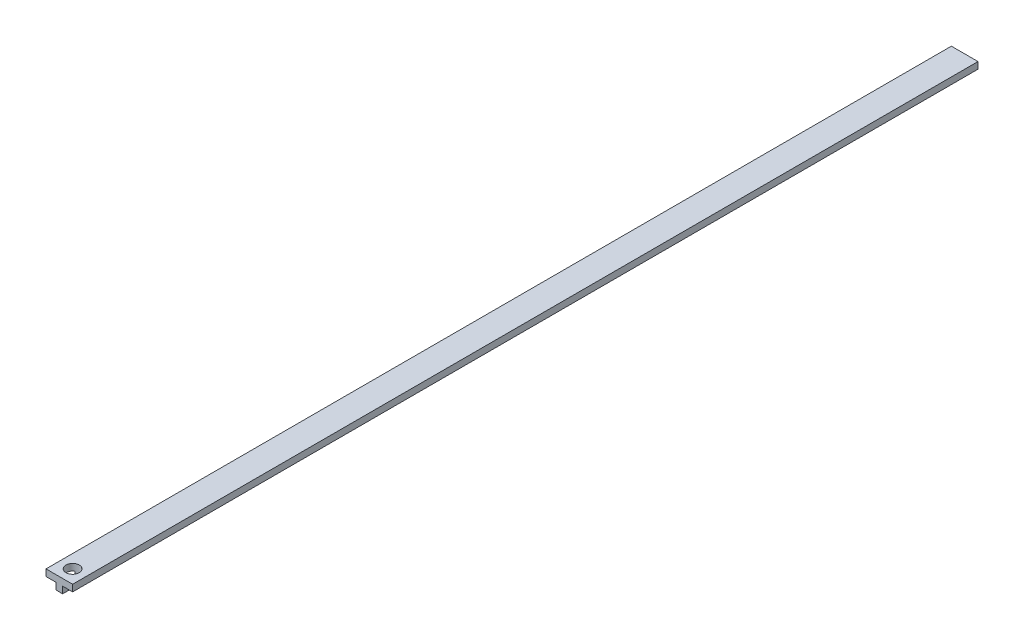
ISO-10303-21;
HEADER;
FILE_DESCRIPTION(('STEP AP214'),'2;1');
FILE_NAME('part.step','',(''),(''),'','','');
FILE_SCHEMA(('AUTOMOTIVE_DESIGN { 1 0 10303 214 1 1 1 1 }'));
ENDSEC;
DATA;
#1=APPLICATION_CONTEXT('core data for automotive mechanical design processes');
#2=APPLICATION_PROTOCOL_DEFINITION('international standard','automotive_design',2000,#1);
#3=PRODUCT_CONTEXT('',#1,'mechanical');
#4=PRODUCT('Part','Part','',(#3));
#5=PRODUCT_RELATED_PRODUCT_CATEGORY('part','',(#4));
#6=PRODUCT_DEFINITION_FORMATION('','',#4);
#7=PRODUCT_DEFINITION_CONTEXT('part definition',#1,'design');
#8=PRODUCT_DEFINITION('design','',#6,#7);
#9=PRODUCT_DEFINITION_SHAPE('','',#8);
#10=(LENGTH_UNIT() NAMED_UNIT(*) SI_UNIT(.MILLI.,.METRE.));
#11=(NAMED_UNIT(*) PLANE_ANGLE_UNIT() SI_UNIT($,.RADIAN.));
#12=(NAMED_UNIT(*) SI_UNIT($,.STERADIAN.) SOLID_ANGLE_UNIT());
#13=UNCERTAINTY_MEASURE_WITH_UNIT(LENGTH_MEASURE(1.E-05),#10,'distance_accuracy_value','');
#14=(GEOMETRIC_REPRESENTATION_CONTEXT(3) GLOBAL_UNCERTAINTY_ASSIGNED_CONTEXT((#13)) GLOBAL_UNIT_ASSIGNED_CONTEXT((#10,
#11,#12)) REPRESENTATION_CONTEXT('',''));
#15=CARTESIAN_POINT('',(0.,0.,0.));
#16=DIRECTION('',(0.,0.,1.));
#17=DIRECTION('',(1.,0.,0.));
#18=AXIS2_PLACEMENT_3D('',#15,#16,#17);
#19=CARTESIAN_POINT('',(-1.5875,-3.175,215.9));
#20=DIRECTION('',(1.,0.,0.));
#21=DIRECTION('',(0.,1.,0.));
#22=AXIS2_PLACEMENT_3D('',#19,#20,#21);
#23=PLANE('',#22);
#24=DIRECTION('',(0.,0.,-1.));
#25=VECTOR('',#24,1.);
#26=CARTESIAN_POINT('',(-1.5875,-3.175,215.9));
#27=LINE('',#26,#25);
#28=CARTESIAN_POINT('',(-1.58750000000001,-3.175,206.800369342984));
#29=VERTEX_POINT('',#28);
#30=CARTESIAN_POINT('',(-1.5875,-3.175,-215.9));
#31=VERTEX_POINT('',#30);
#32=EDGE_CURVE('E205',#29,#31,#27,.T.);
#33=ORIENTED_EDGE('',*,*,#32,.F.);
#34=DIRECTION('',(0.,1.,0.));
#35=VECTOR('',#34,1.);
#36=CARTESIAN_POINT('',(-1.5875,-3.175,206.800369342984));
#37=LINE('',#36,#35);
#38=CARTESIAN_POINT('',(-1.5875,0.,206.800369342984));
#39=VERTEX_POINT('',#38);
#40=EDGE_CURVE('E176',#29,#39,#37,.T.);
#41=ORIENTED_EDGE('',*,*,#40,.T.);
#42=DIRECTION('',(0.,0.,-1.));
#43=VECTOR('',#42,1.);
#44=CARTESIAN_POINT('',(-1.5875,0.,215.9));
#45=LINE('',#44,#43);
#46=CARTESIAN_POINT('',(-1.5875,0.,-215.9));
#47=VERTEX_POINT('',#46);
#48=EDGE_CURVE('E209',#39,#47,#45,.T.);
#49=ORIENTED_EDGE('',*,*,#48,.T.);
#50=DIRECTION('',(0.,-1.,0.));
#51=VECTOR('',#50,1.);
#52=CARTESIAN_POINT('',(-1.5875,-3.175,-215.9));
#53=LINE('',#52,#51);
#54=EDGE_CURVE('E179',#47,#31,#53,.T.);
#55=ORIENTED_EDGE('',*,*,#54,.T.);
#56=EDGE_LOOP('',(#33,#41,#49,#55));
#57=FACE_BOUND('',#56,.T.);
#58=ADVANCED_FACE('F45',(#57),#23,.F.);
#59=CARTESIAN_POINT('',(1.5875,-3.175,215.9));
#60=DIRECTION('',(0.,1.,0.));
#61=DIRECTION('',(0.,0.,1.));
#62=AXIS2_PLACEMENT_3D('',#59,#60,#61);
#63=PLANE('',#62);
#64=DIRECTION('',(0.,0.,-1.));
#65=VECTOR('',#64,1.);
#66=CARTESIAN_POINT('',(1.5875,-3.175,215.9));
#67=LINE('',#66,#65);
#68=CARTESIAN_POINT('',(1.5875,-3.175,206.800369342984));
#69=VERTEX_POINT('',#68);
#70=CARTESIAN_POINT('',(1.5875,-3.175,-215.9));
#71=VERTEX_POINT('',#70);
#72=EDGE_CURVE('E200',#69,#71,#67,.T.);
#73=ORIENTED_EDGE('',*,*,#72,.F.);
#74=CARTESIAN_POINT('',(0.,-3.175,209.55));
#75=DIRECTION('',(0.,1.,0.));
#76=DIRECTION('',(-1.,0.,0.));
#77=AXIS2_PLACEMENT_3D('',#74,#75,#76);
#78=CIRCLE('',#77,3.175);
#79=EDGE_CURVE('E240',#69,#29,#78,.T.);
#80=ORIENTED_EDGE('',*,*,#79,.T.);
#81=ORIENTED_EDGE('',*,*,#32,.T.);
#82=DIRECTION('',(1.,0.,0.));
#83=VECTOR('',#82,1.);
#84=CARTESIAN_POINT('',(1.5875,-3.175,-215.9));
#85=LINE('',#84,#83);
#86=EDGE_CURVE('E182',#31,#71,#85,.T.);
#87=ORIENTED_EDGE('',*,*,#86,.T.);
#88=EDGE_LOOP('',(#73,#80,#81,#87));
#89=FACE_BOUND('',#88,.T.);
#90=ADVANCED_FACE('F236',(#89),#63,.F.);
#91=CARTESIAN_POINT('',(1.5875,0.,215.9));
#92=DIRECTION('',(-1.,0.,0.));
#93=DIRECTION('',(0.,-1.,0.));
#94=AXIS2_PLACEMENT_3D('',#91,#92,#93);
#95=PLANE('',#94);
#96=CARTESIAN_POINT('',(1.5875,-3.175,215.9));
#97=VERTEX_POINT('',#96);
#98=CARTESIAN_POINT('',(1.5875,-3.175,212.299630657016));
#99=VERTEX_POINT('',#98);
#100=EDGE_CURVE('E201',#97,#99,#67,.T.);
#101=ORIENTED_EDGE('',*,*,#100,.T.);
#102=DIRECTION('',(0.,1.,0.));
#103=VECTOR('',#102,1.);
#104=CARTESIAN_POINT('',(1.5875,-3.175,212.299630657016));
#105=LINE('',#104,#103);
#106=CARTESIAN_POINT('',(1.5875,0.,212.299630657016));
#107=VERTEX_POINT('',#106);
#108=EDGE_CURVE('E256',#99,#107,#105,.T.);
#109=ORIENTED_EDGE('',*,*,#108,.T.);
#110=DIRECTION('',(0.,0.,-1.));
#111=VECTOR('',#110,1.);
#112=CARTESIAN_POINT('',(1.5875,0.,215.9));
#113=LINE('',#112,#111);
#114=CARTESIAN_POINT('',(1.5875,0.,215.9));
#115=VERTEX_POINT('',#114);
#116=EDGE_CURVE('E197',#115,#107,#113,.T.);
#117=ORIENTED_EDGE('',*,*,#116,.F.);
#118=DIRECTION('',(0.,1.,0.));
#119=VECTOR('',#118,1.);
#120=CARTESIAN_POINT('',(1.5875,0.,215.9));
#121=LINE('',#120,#119);
#122=EDGE_CURVE('E146',#97,#115,#121,.T.);
#123=ORIENTED_EDGE('',*,*,#122,.F.);
#124=EDGE_LOOP('',(#101,#109,#117,#123));
#125=FACE_BOUND('',#124,.T.);
#126=ADVANCED_FACE('F286',(#125),#95,.F.);
#127=CARTESIAN_POINT('',(-6.35,0.,215.9));
#128=DIRECTION('',(1.,0.,0.));
#129=DIRECTION('',(0.,1.,0.));
#130=AXIS2_PLACEMENT_3D('',#127,#128,#129);
#131=PLANE('',#130);
#132=DIRECTION('',(0.,-1.,0.));
#133=VECTOR('',#132,1.);
#134=CARTESIAN_POINT('',(-6.35,0.,-215.9));
#135=LINE('',#134,#133);
#136=CARTESIAN_POINT('',(-6.35,3.175,-215.9));
#137=VERTEX_POINT('',#136);
#138=CARTESIAN_POINT('',(-6.35,0.,-215.9));
#139=VERTEX_POINT('',#138);
#140=EDGE_CURVE('E172',#137,#139,#135,.T.);
#141=ORIENTED_EDGE('',*,*,#140,.T.);
#142=DIRECTION('',(0.,0.,-1.));
#143=VECTOR('',#142,1.);
#144=CARTESIAN_POINT('',(-6.35,0.,215.9));
#145=LINE('',#144,#143);
#146=CARTESIAN_POINT('',(-6.35,0.,215.9));
#147=VERTEX_POINT('',#146);
#148=EDGE_CURVE('E11',#147,#139,#145,.T.);
#149=ORIENTED_EDGE('',*,*,#148,.F.);
#150=DIRECTION('',(0.,-1.,0.));
#151=VECTOR('',#150,1.);
#152=CARTESIAN_POINT('',(-6.35,0.,215.9));
#153=LINE('',#152,#151);
#154=CARTESIAN_POINT('',(-6.35,3.175,215.9));
#155=VERTEX_POINT('',#154);
#156=EDGE_CURVE('E192',#155,#147,#153,.T.);
#157=ORIENTED_EDGE('',*,*,#156,.F.);
#158=DIRECTION('',(0.,0.,-1.));
#159=VECTOR('',#158,1.);
#160=CARTESIAN_POINT('',(-6.35,3.175,215.9));
#161=LINE('',#160,#159);
#162=EDGE_CURVE('E168',#155,#137,#161,.T.);
#163=ORIENTED_EDGE('',*,*,#162,.T.);
#164=EDGE_LOOP('',(#141,#149,#157,#163));
#165=FACE_BOUND('',#164,.T.);
#166=ADVANCED_FACE('F47',(#165),#131,.F.);
#167=CARTESIAN_POINT('',(-1.5875,0.,215.9));
#168=DIRECTION('',(0.,1.,0.));
#169=DIRECTION('',(-1.,0.,0.));
#170=AXIS2_PLACEMENT_3D('',#167,#168,#169);
#171=PLANE('',#170);
#172=ORIENTED_EDGE('',*,*,#48,.F.);
#173=CARTESIAN_POINT('',(0.,0.,209.55));
#174=DIRECTION('',(0.,1.,0.));
#175=DIRECTION('',(-1.,0.,0.));
#176=AXIS2_PLACEMENT_3D('',#173,#174,#175);
#177=CIRCLE('',#176,3.175);
#178=CARTESIAN_POINT('',(-1.5875,0.,212.299630657016));
#179=VERTEX_POINT('',#178);
#180=EDGE_CURVE('E248',#39,#179,#177,.T.);
#181=ORIENTED_EDGE('',*,*,#180,.T.);
#182=CARTESIAN_POINT('',(-1.5875,0.,215.9));
#183=VERTEX_POINT('',#182);
#184=EDGE_CURVE('E54',#183,#179,#45,.T.);
#185=ORIENTED_EDGE('',*,*,#184,.F.);
#186=DIRECTION('',(1.,0.,0.));
#187=VECTOR('',#186,1.);
#188=CARTESIAN_POINT('',(-1.5875,0.,215.9));
#189=LINE('',#188,#187);
#190=EDGE_CURVE('E118',#147,#183,#189,.T.);
#191=ORIENTED_EDGE('',*,*,#190,.F.);
#192=ORIENTED_EDGE('',*,*,#148,.T.);
#193=DIRECTION('',(1.,0.,0.));
#194=VECTOR('',#193,1.);
#195=CARTESIAN_POINT('',(-1.5875,0.,-215.9));
#196=LINE('',#195,#194);
#197=EDGE_CURVE('E175',#139,#47,#196,.T.);
#198=ORIENTED_EDGE('',*,*,#197,.T.);
#199=EDGE_LOOP('',(#172,#181,#185,#191,#192,#198));
#200=FACE_BOUND('',#199,.T.);
#201=ADVANCED_FACE('F228',(#200),#171,.F.);
#202=ORIENTED_EDGE('',*,*,#184,.T.);
#203=DIRECTION('',(0.,1.,0.));
#204=VECTOR('',#203,1.);
#205=CARTESIAN_POINT('',(-1.5875,-3.175,212.299630657016));
#206=LINE('',#205,#204);
#207=CARTESIAN_POINT('',(-1.58750000000001,-3.175,212.299630657016));
#208=VERTEX_POINT('',#207);
#209=EDGE_CURVE('E249',#179,#208,#206,.F.);
#210=ORIENTED_EDGE('',*,*,#209,.T.);
#211=CARTESIAN_POINT('',(-1.5875,-3.175,215.9));
#212=VERTEX_POINT('',#211);
#213=EDGE_CURVE('E206',#212,#208,#27,.T.);
#214=ORIENTED_EDGE('',*,*,#213,.F.);
#215=DIRECTION('',(0.,-1.,0.));
#216=VECTOR('',#215,1.);
#217=CARTESIAN_POINT('',(-1.5875,-3.175,215.9));
#218=LINE('',#217,#216);
#219=EDGE_CURVE('E271',#183,#212,#218,.T.);
#220=ORIENTED_EDGE('',*,*,#219,.F.);
#221=EDGE_LOOP('',(#202,#210,#214,#220));
#222=FACE_BOUND('',#221,.T.);
#223=ADVANCED_FACE('F301',(#222),#23,.F.);
#224=ORIENTED_EDGE('',*,*,#213,.T.);
#225=EDGE_CURVE('E252',#208,#99,#78,.T.);
#226=ORIENTED_EDGE('',*,*,#225,.T.);
#227=ORIENTED_EDGE('',*,*,#100,.F.);
#228=DIRECTION('',(1.,0.,0.));
#229=VECTOR('',#228,1.);
#230=CARTESIAN_POINT('',(1.5875,-3.175,215.9));
#231=LINE('',#230,#229);
#232=EDGE_CURVE('E274',#212,#97,#231,.T.);
#233=ORIENTED_EDGE('',*,*,#232,.F.);
#234=EDGE_LOOP('',(#224,#226,#227,#233));
#235=FACE_BOUND('',#234,.T.);
#236=ADVANCED_FACE('F282',(#235),#63,.F.);
#237=CARTESIAN_POINT('',(1.5875,0.,206.800369342984));
#238=VERTEX_POINT('',#237);
#239=CARTESIAN_POINT('',(1.5875,0.,-215.9));
#240=VERTEX_POINT('',#239);
#241=EDGE_CURVE('E160',#238,#240,#113,.T.);
#242=ORIENTED_EDGE('',*,*,#241,.F.);
#243=DIRECTION('',(0.,1.,0.));
#244=VECTOR('',#243,1.);
#245=CARTESIAN_POINT('',(1.5875,-3.175,206.800369342984));
#246=LINE('',#245,#244);
#247=EDGE_CURVE('E64',#238,#69,#246,.F.);
#248=ORIENTED_EDGE('',*,*,#247,.T.);
#249=ORIENTED_EDGE('',*,*,#72,.T.);
#250=DIRECTION('',(0.,1.,0.));
#251=VECTOR('',#250,1.);
#252=CARTESIAN_POINT('',(1.5875,0.,-215.9));
#253=LINE('',#252,#251);
#254=EDGE_CURVE('E185',#71,#240,#253,.T.);
#255=ORIENTED_EDGE('',*,*,#254,.T.);
#256=EDGE_LOOP('',(#242,#248,#249,#255));
#257=FACE_BOUND('',#256,.T.);
#258=ADVANCED_FACE('F308',(#257),#95,.F.);
#259=CARTESIAN_POINT('',(6.35,0.,215.9));
#260=DIRECTION('',(0.,1.,0.));
#261=DIRECTION('',(-1.,0.,0.));
#262=AXIS2_PLACEMENT_3D('',#259,#260,#261);
#263=PLANE('',#262);
#264=ORIENTED_EDGE('',*,*,#116,.T.);
#265=CARTESIAN_POINT('',(0.,0.,209.55));
#266=DIRECTION('',(0.,1.,0.));
#267=DIRECTION('',(-1.,0.,0.));
#268=AXIS2_PLACEMENT_3D('',#265,#266,#267);
#269=CIRCLE('',#268,3.175);
#270=EDGE_CURVE('E251',#107,#238,#269,.T.);
#271=ORIENTED_EDGE('',*,*,#270,.T.);
#272=ORIENTED_EDGE('',*,*,#241,.T.);
#273=DIRECTION('',(1.,0.,0.));
#274=VECTOR('',#273,1.);
#275=CARTESIAN_POINT('',(6.35,0.,-215.9));
#276=LINE('',#275,#274);
#277=CARTESIAN_POINT('',(6.35,0.,-215.9));
#278=VERTEX_POINT('',#277);
#279=EDGE_CURVE('E156',#240,#278,#276,.T.);
#280=ORIENTED_EDGE('',*,*,#279,.T.);
#281=DIRECTION('',(0.,0.,-1.));
#282=VECTOR('',#281,1.);
#283=CARTESIAN_POINT('',(6.35,0.,215.9));
#284=LINE('',#283,#282);
#285=CARTESIAN_POINT('',(6.35,0.,215.9));
#286=VERTEX_POINT('',#285);
#287=EDGE_CURVE('E153',#286,#278,#284,.T.);
#288=ORIENTED_EDGE('',*,*,#287,.F.);
#289=DIRECTION('',(1.,0.,0.));
#290=VECTOR('',#289,1.);
#291=CARTESIAN_POINT('',(6.35,0.,215.9));
#292=LINE('',#291,#290);
#293=EDGE_CURVE('E139',#115,#286,#292,.T.);
#294=ORIENTED_EDGE('',*,*,#293,.F.);
#295=EDGE_LOOP('',(#264,#271,#272,#280,#288,#294));
#296=FACE_BOUND('',#295,.T.);
#297=ADVANCED_FACE('F154',(#296),#263,.F.);
#298=CARTESIAN_POINT('',(6.35,3.175,215.9));
#299=DIRECTION('',(-1.,0.,0.));
#300=DIRECTION('',(0.,-1.,0.));
#301=AXIS2_PLACEMENT_3D('',#298,#299,#300);
#302=PLANE('',#301);
#303=DIRECTION('',(0.,1.,0.));
#304=VECTOR('',#303,1.);
#305=CARTESIAN_POINT('',(6.35,3.175,-215.9));
#306=LINE('',#305,#304);
#307=CARTESIAN_POINT('',(6.35,3.175,-215.9));
#308=VERTEX_POINT('',#307);
#309=EDGE_CURVE('E189',#278,#308,#306,.T.);
#310=ORIENTED_EDGE('',*,*,#309,.T.);
#311=DIRECTION('',(0.,0.,-1.));
#312=VECTOR('',#311,1.);
#313=CARTESIAN_POINT('',(6.35,3.175,215.9));
#314=LINE('',#313,#312);
#315=CARTESIAN_POINT('',(6.35,3.175,215.9));
#316=VERTEX_POINT('',#315);
#317=EDGE_CURVE('E161',#316,#308,#314,.T.);
#318=ORIENTED_EDGE('',*,*,#317,.F.);
#319=DIRECTION('',(0.,1.,0.));
#320=VECTOR('',#319,1.);
#321=CARTESIAN_POINT('',(6.35,3.175,215.9));
#322=LINE('',#321,#320);
#323=EDGE_CURVE('E143',#286,#316,#322,.T.);
#324=ORIENTED_EDGE('',*,*,#323,.F.);
#325=ORIENTED_EDGE('',*,*,#287,.T.);
#326=EDGE_LOOP('',(#310,#318,#324,#325));
#327=FACE_BOUND('',#326,.T.);
#328=ADVANCED_FACE('F163',(#327),#302,.F.);
#329=CARTESIAN_POINT('',(-6.35,3.175,215.9));
#330=DIRECTION('',(0.,-1.,0.));
#331=DIRECTION('',(1.,0.,0.));
#332=AXIS2_PLACEMENT_3D('',#329,#330,#331);
#333=PLANE('',#332);
#334=CARTESIAN_POINT('',(0.,3.175,209.55));
#335=DIRECTION('',(0.,1.,0.));
#336=DIRECTION('',(-1.,0.,0.));
#337=AXIS2_PLACEMENT_3D('',#334,#335,#336);
#338=CIRCLE('',#337,3.175);
#339=CARTESIAN_POINT('',(-3.175,3.175,209.55));
#340=VERTEX_POINT('',#339);
#341=EDGE_CURVE('E244',#340,#340,#338,.T.);
#342=ORIENTED_EDGE('',*,*,#341,.F.);
#343=EDGE_LOOP('',(#342));
#344=FACE_BOUND('',#343,.T.);
#345=DIRECTION('',(-1.,0.,0.));
#346=VECTOR('',#345,1.);
#347=CARTESIAN_POINT('',(-6.35,3.175,-215.9));
#348=LINE('',#347,#346);
#349=EDGE_CURVE('E108',#308,#137,#348,.T.);
#350=ORIENTED_EDGE('',*,*,#349,.T.);
#351=ORIENTED_EDGE('',*,*,#162,.F.);
#352=DIRECTION('',(-1.,0.,0.));
#353=VECTOR('',#352,1.);
#354=CARTESIAN_POINT('',(-6.35,3.175,215.9));
#355=LINE('',#354,#353);
#356=EDGE_CURVE('E75',#316,#155,#355,.T.);
#357=ORIENTED_EDGE('',*,*,#356,.F.);
#358=ORIENTED_EDGE('',*,*,#317,.T.);
#359=EDGE_LOOP('',(#350,#351,#357,#358));
#360=FACE_BOUND('',#359,.T.);
#361=ADVANCED_FACE('F326',(#344,#360),#333,.F.);
#362=CARTESIAN_POINT('',(0.,0.,215.9));
#363=DIRECTION('',(0.,0.,-1.));
#364=DIRECTION('',(-1.,0.,0.));
#365=AXIS2_PLACEMENT_3D('',#362,#363,#364);
#366=PLANE('',#365);
#367=ORIENTED_EDGE('',*,*,#156,.T.);
#368=ORIENTED_EDGE('',*,*,#190,.T.);
#369=ORIENTED_EDGE('',*,*,#219,.T.);
#370=ORIENTED_EDGE('',*,*,#232,.T.);
#371=ORIENTED_EDGE('',*,*,#122,.T.);
#372=ORIENTED_EDGE('',*,*,#293,.T.);
#373=ORIENTED_EDGE('',*,*,#323,.T.);
#374=ORIENTED_EDGE('',*,*,#356,.T.);
#375=EDGE_LOOP('',(#367,#368,#369,#370,#371,#372,#373,#374));
#376=FACE_BOUND('',#375,.T.);
#377=ADVANCED_FACE('F141',(#376),#366,.F.);
#378=CARTESIAN_POINT('',(0.,0.,-215.9));
#379=DIRECTION('',(0.,0.,-1.));
#380=DIRECTION('',(-1.,0.,0.));
#381=AXIS2_PLACEMENT_3D('',#378,#379,#380);
#382=PLANE('',#381);
#383=ORIENTED_EDGE('',*,*,#140,.F.);
#384=ORIENTED_EDGE('',*,*,#349,.F.);
#385=ORIENTED_EDGE('',*,*,#309,.F.);
#386=ORIENTED_EDGE('',*,*,#279,.F.);
#387=ORIENTED_EDGE('',*,*,#254,.F.);
#388=ORIENTED_EDGE('',*,*,#86,.F.);
#389=ORIENTED_EDGE('',*,*,#54,.F.);
#390=ORIENTED_EDGE('',*,*,#197,.F.);
#391=EDGE_LOOP('',(#383,#384,#385,#386,#387,#388,#389,#390));
#392=FACE_BOUND('',#391,.T.);
#393=ADVANCED_FACE('F232',(#392),#382,.T.);
#394=CARTESIAN_POINT('',(0.,-3.175,209.55));
#395=DIRECTION('',(0.,1.,0.));
#396=DIRECTION('',(-1.,0.,0.));
#397=AXIS2_PLACEMENT_3D('',#394,#395,#396);
#398=CYLINDRICAL_SURFACE('',#397,3.175);
#399=ORIENTED_EDGE('',*,*,#341,.T.);
#400=EDGE_LOOP('',(#399));
#401=FACE_BOUND('',#400,.T.);
#402=ORIENTED_EDGE('',*,*,#79,.F.);
#403=ORIENTED_EDGE('',*,*,#247,.F.);
#404=ORIENTED_EDGE('',*,*,#270,.F.);
#405=ORIENTED_EDGE('',*,*,#108,.F.);
#406=ORIENTED_EDGE('',*,*,#225,.F.);
#407=ORIENTED_EDGE('',*,*,#209,.F.);
#408=ORIENTED_EDGE('',*,*,#180,.F.);
#409=ORIENTED_EDGE('',*,*,#40,.F.);
#410=EDGE_LOOP('',(#402,#403,#404,#405,#406,#407,#408,#409));
#411=FACE_BOUND('',#410,.T.);
#412=ADVANCED_FACE('F299',(#401,#411),#398,.F.);
#413=CLOSED_SHELL('',(#58,#90,#126,#166,#201,#223,#236,#258,#297,#328,#361,#377,#393,#412));
#414=MANIFOLD_SOLID_BREP('B2',#413);
#415=ADVANCED_BREP_SHAPE_REPRESENTATION('',(#18,#414),#14);
#416=SHAPE_DEFINITION_REPRESENTATION(#9,#415);
ENDSEC;
END-ISO-10303-21;
